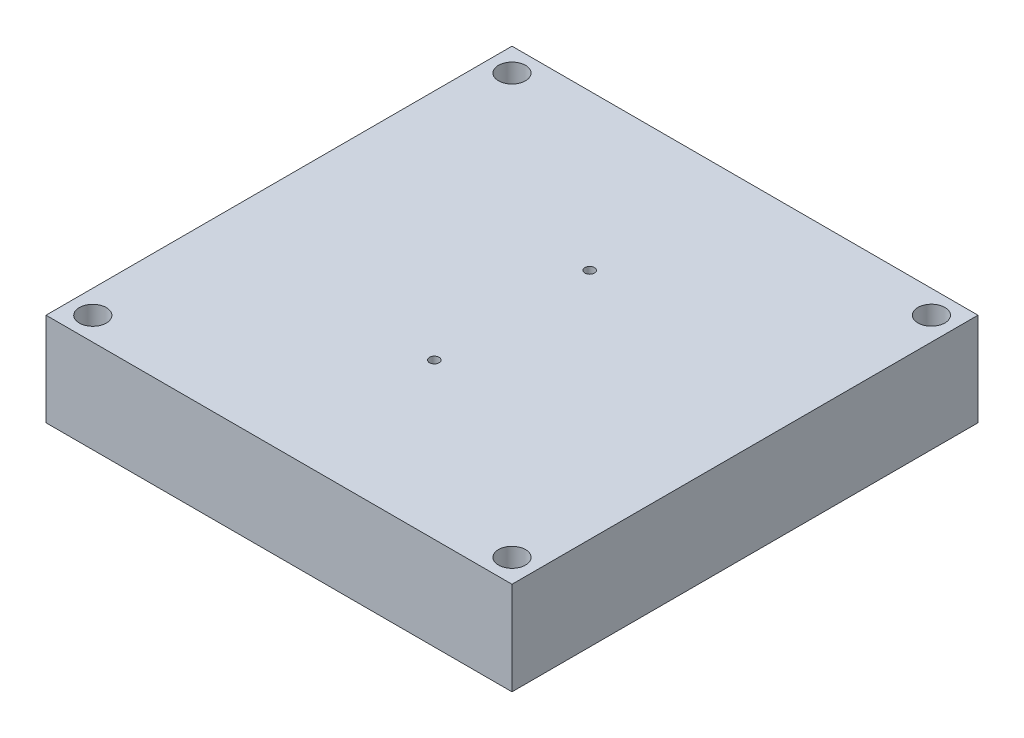
ISO-10303-21;
HEADER;
FILE_DESCRIPTION(('STEP AP214'),'2;1');
FILE_NAME('part.step','',(''),(''),'','','');
FILE_SCHEMA(('AUTOMOTIVE_DESIGN { 1 0 10303 214 1 1 1 1 }'));
ENDSEC;
DATA;
#1=APPLICATION_CONTEXT('core data for automotive mechanical design processes');
#2=APPLICATION_PROTOCOL_DEFINITION('international standard','automotive_design',2000,#1);
#3=PRODUCT_CONTEXT('',#1,'mechanical');
#4=PRODUCT('Part','Part','',(#3));
#5=PRODUCT_RELATED_PRODUCT_CATEGORY('part','',(#4));
#6=PRODUCT_DEFINITION_FORMATION('','',#4);
#7=PRODUCT_DEFINITION_CONTEXT('part definition',#1,'design');
#8=PRODUCT_DEFINITION('design','',#6,#7);
#9=PRODUCT_DEFINITION_SHAPE('','',#8);
#10=(LENGTH_UNIT() NAMED_UNIT(*) SI_UNIT(.MILLI.,.METRE.));
#11=(NAMED_UNIT(*) PLANE_ANGLE_UNIT() SI_UNIT($,.RADIAN.));
#12=(NAMED_UNIT(*) SI_UNIT($,.STERADIAN.) SOLID_ANGLE_UNIT());
#13=UNCERTAINTY_MEASURE_WITH_UNIT(LENGTH_MEASURE(1.E-05),#10,'distance_accuracy_value','');
#14=(GEOMETRIC_REPRESENTATION_CONTEXT(3) GLOBAL_UNCERTAINTY_ASSIGNED_CONTEXT((#13)) GLOBAL_UNIT_ASSIGNED_CONTEXT((#10,
#11,#12)) REPRESENTATION_CONTEXT('',''));
#15=CARTESIAN_POINT('',(0.,0.,0.));
#16=DIRECTION('',(0.,0.,1.));
#17=DIRECTION('',(1.,0.,0.));
#18=AXIS2_PLACEMENT_3D('',#15,#16,#17);
#19=CARTESIAN_POINT('',(-28.5714285714285,20.,-47.1428571428572));
#20=DIRECTION('',(1.,0.,0.));
#21=DIRECTION('',(0.,0.,-1.));
#22=AXIS2_PLACEMENT_3D('',#19,#20,#21);
#23=PLANE('',#22);
#24=DIRECTION('',(0.,0.,1.));
#25=VECTOR('',#24,1.);
#26=CARTESIAN_POINT('',(-28.5714285714285,0.,-47.1428571428572));
#27=LINE('',#26,#25);
#28=CARTESIAN_POINT('',(-28.5714285714285,0.,-47.1428571428572));
#29=VERTEX_POINT('',#28);
#30=CARTESIAN_POINT('',(-28.5714285714285,0.,52.8571428571429));
#31=VERTEX_POINT('',#30);
#32=EDGE_CURVE('E110',#29,#31,#27,.T.);
#33=ORIENTED_EDGE('',*,*,#32,.T.);
#34=DIRECTION('',(0.,-1.,0.));
#35=VECTOR('',#34,1.);
#36=CARTESIAN_POINT('',(-28.5714285714285,20.,52.8571428571429));
#37=LINE('',#36,#35);
#38=CARTESIAN_POINT('',(-28.5714285714285,20.,52.8571428571429));
#39=VERTEX_POINT('',#38);
#40=EDGE_CURVE('E11',#39,#31,#37,.T.);
#41=ORIENTED_EDGE('',*,*,#40,.F.);
#42=DIRECTION('',(0.,0.,1.));
#43=VECTOR('',#42,1.);
#44=CARTESIAN_POINT('',(-28.5714285714285,20.,-47.1428571428572));
#45=LINE('',#44,#43);
#46=CARTESIAN_POINT('',(-28.5714285714285,20.,-47.1428571428572));
#47=VERTEX_POINT('',#46);
#48=EDGE_CURVE('E94',#47,#39,#45,.T.);
#49=ORIENTED_EDGE('',*,*,#48,.F.);
#50=DIRECTION('',(0.,-1.,0.));
#51=VECTOR('',#50,1.);
#52=CARTESIAN_POINT('',(-28.5714285714285,20.,-47.1428571428572));
#53=LINE('',#52,#51);
#54=EDGE_CURVE('E106',#47,#29,#53,.T.);
#55=ORIENTED_EDGE('',*,*,#54,.T.);
#56=EDGE_LOOP('',(#33,#41,#49,#55));
#57=FACE_BOUND('',#56,.T.);
#58=ADVANCED_FACE('F42',(#57),#23,.F.);
#59=CARTESIAN_POINT('',(-28.5714285714285,20.,52.8571428571429));
#60=DIRECTION('',(0.,0.,-1.));
#61=DIRECTION('',(-1.,0.,0.));
#62=AXIS2_PLACEMENT_3D('',#59,#60,#61);
#63=PLANE('',#62);
#64=DIRECTION('',(1.,0.,0.));
#65=VECTOR('',#64,1.);
#66=CARTESIAN_POINT('',(-28.5714285714285,0.,52.8571428571429));
#67=LINE('',#66,#65);
#68=CARTESIAN_POINT('',(71.4285714285715,0.,52.8571428571429));
#69=VERTEX_POINT('',#68);
#70=EDGE_CURVE('E99',#31,#69,#67,.T.);
#71=ORIENTED_EDGE('',*,*,#70,.T.);
#72=DIRECTION('',(0.,-1.,0.));
#73=VECTOR('',#72,1.);
#74=CARTESIAN_POINT('',(71.4285714285715,20.,52.8571428571429));
#75=LINE('',#74,#73);
#76=CARTESIAN_POINT('',(71.4285714285715,20.,52.8571428571429));
#77=VERTEX_POINT('',#76);
#78=EDGE_CURVE('E51',#77,#69,#75,.T.);
#79=ORIENTED_EDGE('',*,*,#78,.F.);
#80=DIRECTION('',(1.,0.,0.));
#81=VECTOR('',#80,1.);
#82=CARTESIAN_POINT('',(-28.5714285714285,20.,52.8571428571429));
#83=LINE('',#82,#81);
#84=EDGE_CURVE('E89',#39,#77,#83,.T.);
#85=ORIENTED_EDGE('',*,*,#84,.F.);
#86=ORIENTED_EDGE('',*,*,#40,.T.);
#87=EDGE_LOOP('',(#71,#79,#85,#86));
#88=FACE_BOUND('',#87,.T.);
#89=ADVANCED_FACE('F98',(#88),#63,.F.);
#90=CARTESIAN_POINT('',(71.4285714285715,20.,-47.1428571428572));
#91=DIRECTION('',(-1.,0.,0.));
#92=DIRECTION('',(0.,0.,1.));
#93=AXIS2_PLACEMENT_3D('',#90,#91,#92);
#94=PLANE('',#93);
#95=DIRECTION('',(0.,0.,-1.));
#96=VECTOR('',#95,1.);
#97=CARTESIAN_POINT('',(71.4285714285715,0.,-47.1428571428572));
#98=LINE('',#97,#96);
#99=CARTESIAN_POINT('',(71.4285714285715,0.,-47.1428571428572));
#100=VERTEX_POINT('',#99);
#101=EDGE_CURVE('E76',#69,#100,#98,.T.);
#102=ORIENTED_EDGE('',*,*,#101,.T.);
#103=DIRECTION('',(0.,-1.,0.));
#104=VECTOR('',#103,1.);
#105=CARTESIAN_POINT('',(71.4285714285715,20.,-47.1428571428572));
#106=LINE('',#105,#104);
#107=CARTESIAN_POINT('',(71.4285714285715,20.,-47.1428571428572));
#108=VERTEX_POINT('',#107);
#109=EDGE_CURVE('E101',#108,#100,#106,.T.);
#110=ORIENTED_EDGE('',*,*,#109,.F.);
#111=DIRECTION('',(0.,0.,-1.));
#112=VECTOR('',#111,1.);
#113=CARTESIAN_POINT('',(71.4285714285715,20.,-47.1428571428572));
#114=LINE('',#113,#112);
#115=EDGE_CURVE('E92',#77,#108,#114,.T.);
#116=ORIENTED_EDGE('',*,*,#115,.F.);
#117=ORIENTED_EDGE('',*,*,#78,.T.);
#118=EDGE_LOOP('',(#102,#110,#116,#117));
#119=FACE_BOUND('',#118,.T.);
#120=ADVANCED_FACE('F102',(#119),#94,.F.);
#121=CARTESIAN_POINT('',(-28.5714285714285,20.,-47.1428571428572));
#122=DIRECTION('',(0.,0.,1.));
#123=DIRECTION('',(1.,0.,0.));
#124=AXIS2_PLACEMENT_3D('',#121,#122,#123);
#125=PLANE('',#124);
#126=DIRECTION('',(-1.,0.,0.));
#127=VECTOR('',#126,1.);
#128=CARTESIAN_POINT('',(-28.5714285714285,0.,-47.1428571428572));
#129=LINE('',#128,#127);
#130=EDGE_CURVE('E82',#100,#29,#129,.T.);
#131=ORIENTED_EDGE('',*,*,#130,.T.);
#132=ORIENTED_EDGE('',*,*,#54,.F.);
#133=DIRECTION('',(-1.,0.,0.));
#134=VECTOR('',#133,1.);
#135=CARTESIAN_POINT('',(-28.5714285714285,20.,-47.1428571428572));
#136=LINE('',#135,#134);
#137=EDGE_CURVE('E59',#108,#47,#136,.T.);
#138=ORIENTED_EDGE('',*,*,#137,.F.);
#139=ORIENTED_EDGE('',*,*,#109,.T.);
#140=EDGE_LOOP('',(#131,#132,#138,#139));
#141=FACE_BOUND('',#140,.T.);
#142=ADVANCED_FACE('F124',(#141),#125,.F.);
#143=CARTESIAN_POINT('',(0.,20.,0.));
#144=DIRECTION('',(0.,1.,0.));
#145=DIRECTION('',(0.,0.,1.));
#146=AXIS2_PLACEMENT_3D('',#143,#144,#145);
#147=PLANE('',#146);
#148=CARTESIAN_POINT('',(-23.5304880717696,20.,47.8571428571429));
#149=DIRECTION('',(0.,1.,0.));
#150=DIRECTION('',(0.,0.,1.));
#151=AXIS2_PLACEMENT_3D('',#148,#149,#150);
#152=CIRCLE('',#151,2.8956);
#153=CARTESIAN_POINT('',(-23.5304880717696,20.,50.7527428571429));
#154=VERTEX_POINT('',#153);
#155=EDGE_CURVE('E182',#154,#154,#152,.T.);
#156=ORIENTED_EDGE('',*,*,#155,.F.);
#157=EDGE_LOOP('',(#156));
#158=FACE_BOUND('',#157,.T.);
#159=CARTESIAN_POINT('',(66.4285714285715,20.,47.8571428571429));
#160=DIRECTION('',(0.,1.,0.));
#161=DIRECTION('',(0.,0.,1.));
#162=AXIS2_PLACEMENT_3D('',#159,#160,#161);
#163=CIRCLE('',#162,2.8956);
#164=CARTESIAN_POINT('',(66.4285714285715,20.,50.7527428571429));
#165=VERTEX_POINT('',#164);
#166=EDGE_CURVE('E174',#165,#165,#163,.T.);
#167=ORIENTED_EDGE('',*,*,#166,.F.);
#168=EDGE_LOOP('',(#167));
#169=FACE_BOUND('',#168,.T.);
#170=CARTESIAN_POINT('',(66.4285714285715,20.,-42.1428571428572));
#171=DIRECTION('',(0.,1.,0.));
#172=DIRECTION('',(0.,0.,1.));
#173=AXIS2_PLACEMENT_3D('',#170,#171,#172);
#174=CIRCLE('',#173,2.8956);
#175=CARTESIAN_POINT('',(66.4285714285715,20.,-39.2472571428572));
#176=VERTEX_POINT('',#175);
#177=EDGE_CURVE('E166',#176,#176,#174,.T.);
#178=ORIENTED_EDGE('',*,*,#177,.F.);
#179=EDGE_LOOP('',(#178));
#180=FACE_BOUND('',#179,.T.);
#181=CARTESIAN_POINT('',(-23.5714285714285,20.,-42.1428571428572));
#182=DIRECTION('',(0.,1.,0.));
#183=DIRECTION('',(0.,0.,1.));
#184=AXIS2_PLACEMENT_3D('',#181,#182,#183);
#185=CIRCLE('',#184,2.8956);
#186=CARTESIAN_POINT('',(-23.5714285714285,20.,-39.2472571428572));
#187=VERTEX_POINT('',#186);
#188=EDGE_CURVE('E158',#187,#187,#185,.T.);
#189=ORIENTED_EDGE('',*,*,#188,.F.);
#190=EDGE_LOOP('',(#189));
#191=FACE_BOUND('',#190,.T.);
#192=CARTESIAN_POINT('',(21.4285714285715,20.,-13.8095238095238));
#193=DIRECTION('',(0.,-1.,0.));
#194=DIRECTION('',(0.,0.,-1.));
#195=AXIS2_PLACEMENT_3D('',#192,#193,#194);
#196=CIRCLE('',#195,1.02869999999999);
#197=CARTESIAN_POINT('',(21.4285714285715,20.,-14.8382238095238));
#198=VERTEX_POINT('',#197);
#199=EDGE_CURVE('E142',#198,#198,#196,.T.);
#200=ORIENTED_EDGE('',*,*,#199,.T.);
#201=EDGE_LOOP('',(#200));
#202=FACE_BOUND('',#201,.T.);
#203=CARTESIAN_POINT('',(21.4285714285715,20.,19.5238095238129));
#204=DIRECTION('',(0.,-1.,0.));
#205=DIRECTION('',(0.,0.,-1.));
#206=AXIS2_PLACEMENT_3D('',#203,#204,#205);
#207=CIRCLE('',#206,1.02869999999999);
#208=CARTESIAN_POINT('',(21.4285714285715,20.,18.4951095238129));
#209=VERTEX_POINT('',#208);
#210=EDGE_CURVE('E114',#209,#209,#207,.T.);
#211=ORIENTED_EDGE('',*,*,#210,.T.);
#212=EDGE_LOOP('',(#211));
#213=FACE_BOUND('',#212,.T.);
#214=ORIENTED_EDGE('',*,*,#48,.T.);
#215=ORIENTED_EDGE('',*,*,#84,.T.);
#216=ORIENTED_EDGE('',*,*,#115,.T.);
#217=ORIENTED_EDGE('',*,*,#137,.T.);
#218=EDGE_LOOP('',(#214,#215,#216,#217));
#219=FACE_BOUND('',#218,.T.);
#220=ADVANCED_FACE('F90',(#158,#169,#180,#191,#202,#213,#219),#147,.T.);
#221=CARTESIAN_POINT('',(0.,0.,0.));
#222=DIRECTION('',(0.,1.,0.));
#223=DIRECTION('',(0.,0.,1.));
#224=AXIS2_PLACEMENT_3D('',#221,#222,#223);
#225=PLANE('',#224);
#226=CARTESIAN_POINT('',(-23.5304880717696,0.,47.8571428571429));
#227=DIRECTION('',(0.,1.,0.));
#228=DIRECTION('',(0.,0.,1.));
#229=AXIS2_PLACEMENT_3D('',#226,#227,#228);
#230=CIRCLE('',#229,2.89559999999999);
#231=CARTESIAN_POINT('',(-23.5304880717696,0.,50.7527428571429));
#232=VERTEX_POINT('',#231);
#233=EDGE_CURVE('E178',#232,#232,#230,.T.);
#234=ORIENTED_EDGE('',*,*,#233,.T.);
#235=EDGE_LOOP('',(#234));
#236=FACE_BOUND('',#235,.T.);
#237=CARTESIAN_POINT('',(66.4285714285715,0.,47.8571428571429));
#238=DIRECTION('',(0.,1.,0.));
#239=DIRECTION('',(0.,0.,1.));
#240=AXIS2_PLACEMENT_3D('',#237,#238,#239);
#241=CIRCLE('',#240,2.8956);
#242=CARTESIAN_POINT('',(66.4285714285715,0.,50.7527428571429));
#243=VERTEX_POINT('',#242);
#244=EDGE_CURVE('E170',#243,#243,#241,.T.);
#245=ORIENTED_EDGE('',*,*,#244,.T.);
#246=EDGE_LOOP('',(#245));
#247=FACE_BOUND('',#246,.T.);
#248=CARTESIAN_POINT('',(66.4285714285715,0.,-42.1428571428572));
#249=DIRECTION('',(0.,1.,0.));
#250=DIRECTION('',(0.,0.,1.));
#251=AXIS2_PLACEMENT_3D('',#248,#249,#250);
#252=CIRCLE('',#251,2.8956);
#253=CARTESIAN_POINT('',(66.4285714285715,0.,-39.2472571428572));
#254=VERTEX_POINT('',#253);
#255=EDGE_CURVE('E162',#254,#254,#252,.T.);
#256=ORIENTED_EDGE('',*,*,#255,.T.);
#257=EDGE_LOOP('',(#256));
#258=FACE_BOUND('',#257,.T.);
#259=CARTESIAN_POINT('',(-23.5714285714285,0.,-42.1428571428572));
#260=DIRECTION('',(0.,1.,0.));
#261=DIRECTION('',(0.,0.,1.));
#262=AXIS2_PLACEMENT_3D('',#259,#260,#261);
#263=CIRCLE('',#262,2.89559999999999);
#264=CARTESIAN_POINT('',(-23.5714285714285,0.,-39.2472571428572));
#265=VERTEX_POINT('',#264);
#266=EDGE_CURVE('E154',#265,#265,#263,.T.);
#267=ORIENTED_EDGE('',*,*,#266,.T.);
#268=EDGE_LOOP('',(#267));
#269=FACE_BOUND('',#268,.T.);
#270=CARTESIAN_POINT('',(21.4285714285715,0.,-13.8095238095238));
#271=DIRECTION('',(0.,-1.,0.));
#272=DIRECTION('',(0.,0.,-1.));
#273=AXIS2_PLACEMENT_3D('',#270,#271,#272);
#274=CIRCLE('',#273,1.8542);
#275=CARTESIAN_POINT('',(21.4285714285715,0.,-15.6637238095238));
#276=VERTEX_POINT('',#275);
#277=EDGE_CURVE('E150',#276,#276,#274,.T.);
#278=ORIENTED_EDGE('',*,*,#277,.F.);
#279=EDGE_LOOP('',(#278));
#280=FACE_BOUND('',#279,.T.);
#281=CARTESIAN_POINT('',(21.4285714285715,0.,19.5238095238129));
#282=DIRECTION('',(0.,-1.,0.));
#283=DIRECTION('',(0.,0.,-1.));
#284=AXIS2_PLACEMENT_3D('',#281,#282,#283);
#285=CIRCLE('',#284,1.8542);
#286=CARTESIAN_POINT('',(21.4285714285715,0.,17.6696095238128));
#287=VERTEX_POINT('',#286);
#288=EDGE_CURVE('E138',#287,#287,#285,.T.);
#289=ORIENTED_EDGE('',*,*,#288,.F.);
#290=EDGE_LOOP('',(#289));
#291=FACE_BOUND('',#290,.T.);
#292=ORIENTED_EDGE('',*,*,#32,.F.);
#293=ORIENTED_EDGE('',*,*,#130,.F.);
#294=ORIENTED_EDGE('',*,*,#101,.F.);
#295=ORIENTED_EDGE('',*,*,#70,.F.);
#296=EDGE_LOOP('',(#292,#293,#294,#295));
#297=FACE_BOUND('',#296,.T.);
#298=ADVANCED_FACE('F127',(#236,#247,#258,#269,#280,#291,#297),#225,.F.);
#299=CARTESIAN_POINT('',(21.4285714285715,0.,19.5238095238129));
#300=DIRECTION('',(0.,-1.,0.));
#301=DIRECTION('',(0.,0.,-1.));
#302=AXIS2_PLACEMENT_3D('',#299,#300,#301);
#303=CYLINDRICAL_SURFACE('',#302,1.02869999999999);
#304=ORIENTED_EDGE('',*,*,#210,.F.);
#305=EDGE_LOOP('',(#304));
#306=FACE_BOUND('',#305,.T.);
#307=CARTESIAN_POINT('',(21.4285714285715,0.692676745536851,19.5238095238129));
#308=DIRECTION('',(0.,-1.,0.));
#309=DIRECTION('',(0.,0.,-1.));
#310=AXIS2_PLACEMENT_3D('',#307,#308,#309);
#311=CIRCLE('',#310,1.02869999999999);
#312=CARTESIAN_POINT('',(21.4285714285715,0.692676745536851,18.4951095238129));
#313=VERTEX_POINT('',#312);
#314=EDGE_CURVE('E134',#313,#313,#311,.T.);
#315=ORIENTED_EDGE('',*,*,#314,.T.);
#316=EDGE_LOOP('',(#315));
#317=FACE_BOUND('',#316,.T.);
#318=ADVANCED_FACE('F202',(#306,#317),#303,.F.);
#319=CARTESIAN_POINT('',(21.4285714285715,0.,19.5238095238129));
#320=DIRECTION('',(0.,-1.,0.));
#321=DIRECTION('',(0.,0.,-1.));
#322=AXIS2_PLACEMENT_3D('',#319,#320,#321);
#323=CONICAL_SURFACE('',#322,1.8542,0.872664625997165);
#324=ORIENTED_EDGE('',*,*,#314,.F.);
#325=EDGE_LOOP('',(#324));
#326=FACE_BOUND('',#325,.T.);
#327=ORIENTED_EDGE('',*,*,#288,.T.);
#328=EDGE_LOOP('',(#327));
#329=FACE_BOUND('',#328,.T.);
#330=ADVANCED_FACE('F205',(#326,#329),#323,.F.);
#331=CARTESIAN_POINT('',(21.4285714285715,0.,-13.8095238095238));
#332=DIRECTION('',(0.,-1.,0.));
#333=DIRECTION('',(0.,0.,-1.));
#334=AXIS2_PLACEMENT_3D('',#331,#332,#333);
#335=CYLINDRICAL_SURFACE('',#334,1.02869999999999);
#336=ORIENTED_EDGE('',*,*,#199,.F.);
#337=EDGE_LOOP('',(#336));
#338=FACE_BOUND('',#337,.T.);
#339=CARTESIAN_POINT('',(21.4285714285715,0.692676745536851,-13.8095238095238));
#340=DIRECTION('',(0.,-1.,0.));
#341=DIRECTION('',(0.,0.,-1.));
#342=AXIS2_PLACEMENT_3D('',#339,#340,#341);
#343=CIRCLE('',#342,1.02869999999999);
#344=CARTESIAN_POINT('',(21.4285714285715,0.692676745536851,-14.8382238095238));
#345=VERTEX_POINT('',#344);
#346=EDGE_CURVE('E146',#345,#345,#343,.T.);
#347=ORIENTED_EDGE('',*,*,#346,.T.);
#348=EDGE_LOOP('',(#347));
#349=FACE_BOUND('',#348,.T.);
#350=ADVANCED_FACE('F211',(#338,#349),#335,.F.);
#351=CARTESIAN_POINT('',(21.4285714285715,0.,-13.8095238095238));
#352=DIRECTION('',(0.,-1.,0.));
#353=DIRECTION('',(0.,0.,-1.));
#354=AXIS2_PLACEMENT_3D('',#351,#352,#353);
#355=CONICAL_SURFACE('',#354,1.8542,0.872664625997165);
#356=ORIENTED_EDGE('',*,*,#346,.F.);
#357=EDGE_LOOP('',(#356));
#358=FACE_BOUND('',#357,.T.);
#359=ORIENTED_EDGE('',*,*,#277,.T.);
#360=EDGE_LOOP('',(#359));
#361=FACE_BOUND('',#360,.T.);
#362=ADVANCED_FACE('F263',(#358,#361),#355,.F.);
#363=CARTESIAN_POINT('',(-23.5714285714285,20.,-42.1428571428572));
#364=DIRECTION('',(0.,1.,0.));
#365=DIRECTION('',(0.,0.,1.));
#366=AXIS2_PLACEMENT_3D('',#363,#364,#365);
#367=CYLINDRICAL_SURFACE('',#366,2.8956);
#368=ORIENTED_EDGE('',*,*,#266,.F.);
#369=EDGE_LOOP('',(#368));
#370=FACE_BOUND('',#369,.T.);
#371=ORIENTED_EDGE('',*,*,#188,.T.);
#372=EDGE_LOOP('',(#371));
#373=FACE_BOUND('',#372,.T.);
#374=ADVANCED_FACE('F270',(#370,#373),#367,.F.);
#375=CARTESIAN_POINT('',(66.4285714285715,20.,-42.1428571428572));
#376=DIRECTION('',(0.,1.,0.));
#377=DIRECTION('',(0.,0.,1.));
#378=AXIS2_PLACEMENT_3D('',#375,#376,#377);
#379=CYLINDRICAL_SURFACE('',#378,2.8956);
#380=ORIENTED_EDGE('',*,*,#255,.F.);
#381=EDGE_LOOP('',(#380));
#382=FACE_BOUND('',#381,.T.);
#383=ORIENTED_EDGE('',*,*,#177,.T.);
#384=EDGE_LOOP('',(#383));
#385=FACE_BOUND('',#384,.T.);
#386=ADVANCED_FACE('F277',(#382,#385),#379,.F.);
#387=CARTESIAN_POINT('',(66.4285714285715,20.,47.8571428571429));
#388=DIRECTION('',(0.,1.,0.));
#389=DIRECTION('',(0.,0.,1.));
#390=AXIS2_PLACEMENT_3D('',#387,#388,#389);
#391=CYLINDRICAL_SURFACE('',#390,2.8956);
#392=ORIENTED_EDGE('',*,*,#244,.F.);
#393=EDGE_LOOP('',(#392));
#394=FACE_BOUND('',#393,.T.);
#395=ORIENTED_EDGE('',*,*,#166,.T.);
#396=EDGE_LOOP('',(#395));
#397=FACE_BOUND('',#396,.T.);
#398=ADVANCED_FACE('F285',(#394,#397),#391,.F.);
#399=CARTESIAN_POINT('',(-23.5304880717696,20.,47.8571428571429));
#400=DIRECTION('',(0.,1.,0.));
#401=DIRECTION('',(0.,0.,1.));
#402=AXIS2_PLACEMENT_3D('',#399,#400,#401);
#403=CYLINDRICAL_SURFACE('',#402,2.8956);
#404=ORIENTED_EDGE('',*,*,#233,.F.);
#405=EDGE_LOOP('',(#404));
#406=FACE_BOUND('',#405,.T.);
#407=ORIENTED_EDGE('',*,*,#155,.T.);
#408=EDGE_LOOP('',(#407));
#409=FACE_BOUND('',#408,.T.);
#410=ADVANCED_FACE('F187',(#406,#409),#403,.F.);
#411=CLOSED_SHELL('',(#58,#89,#120,#142,#220,#298,#318,#330,#350,#362,#374,#386,#398,#410));
#412=MANIFOLD_SOLID_BREP('B2',#411);
#413=ADVANCED_BREP_SHAPE_REPRESENTATION('',(#18,#412),#14);
#414=SHAPE_DEFINITION_REPRESENTATION(#9,#413);
ENDSEC;
END-ISO-10303-21;
